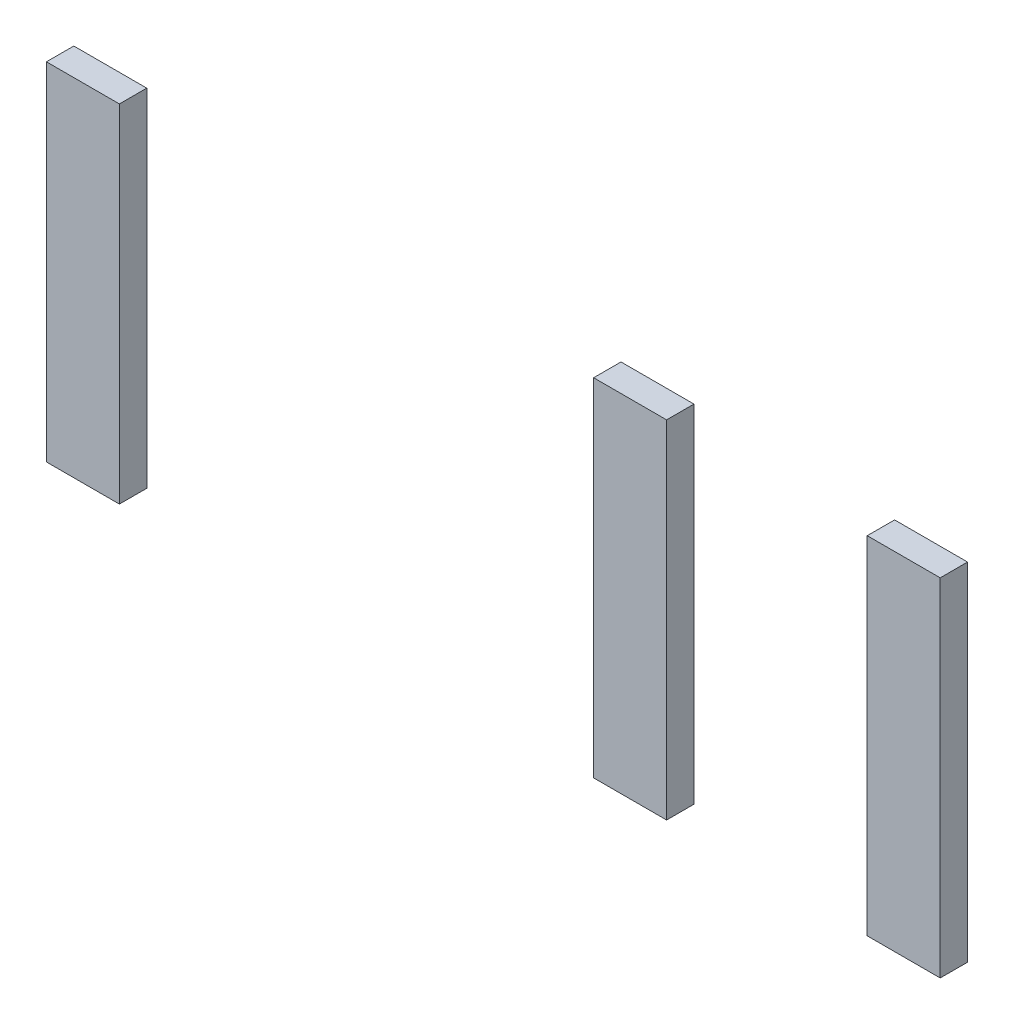
ISO-10303-21;
HEADER;
FILE_DESCRIPTION(('STEP AP214'),'2;1');
FILE_NAME('part.step','',(''),(''),'','','');
FILE_SCHEMA(('AUTOMOTIVE_DESIGN { 1 0 10303 214 1 1 1 1 }'));
ENDSEC;
DATA;
#1=APPLICATION_CONTEXT('core data for automotive mechanical design processes');
#2=APPLICATION_PROTOCOL_DEFINITION('international standard','automotive_design',2000,#1);
#3=PRODUCT_CONTEXT('',#1,'mechanical');
#4=PRODUCT('Part','Part','',(#3));
#5=PRODUCT_RELATED_PRODUCT_CATEGORY('part','',(#4));
#6=PRODUCT_DEFINITION_FORMATION('','',#4);
#7=PRODUCT_DEFINITION_CONTEXT('part definition',#1,'design');
#8=PRODUCT_DEFINITION('design','',#6,#7);
#9=PRODUCT_DEFINITION_SHAPE('','',#8);
#10=(LENGTH_UNIT() NAMED_UNIT(*) SI_UNIT(.MILLI.,.METRE.));
#11=(NAMED_UNIT(*) PLANE_ANGLE_UNIT() SI_UNIT($,.RADIAN.));
#12=(NAMED_UNIT(*) SI_UNIT($,.STERADIAN.) SOLID_ANGLE_UNIT());
#13=UNCERTAINTY_MEASURE_WITH_UNIT(LENGTH_MEASURE(1.E-05),#10,'distance_accuracy_value','');
#14=(GEOMETRIC_REPRESENTATION_CONTEXT(3) GLOBAL_UNCERTAINTY_ASSIGNED_CONTEXT((#13)) GLOBAL_UNIT_ASSIGNED_CONTEXT((#10,
#11,#12)) REPRESENTATION_CONTEXT('',''));
#15=CARTESIAN_POINT('',(0.,0.,0.));
#16=DIRECTION('',(0.,0.,1.));
#17=DIRECTION('',(1.,0.,0.));
#18=AXIS2_PLACEMENT_3D('',#15,#16,#17);
#19=CARTESIAN_POINT('',(0.75,0.329601407051,0.15));
#20=DIRECTION('',(0.,0.,1.));
#21=DIRECTION('',(1.,0.,0.));
#22=AXIS2_PLACEMENT_3D('',#19,#20,#21);
#23=PLANE('',#22);
#24=DIRECTION('',(1.,0.,0.));
#25=VECTOR('',#24,1.);
#26=CARTESIAN_POINT('',(0.75,0.329601407051,0.15));
#27=LINE('',#26,#25);
#28=CARTESIAN_POINT('',(0.55,0.329601407051,0.15));
#29=VERTEX_POINT('',#28);
#30=CARTESIAN_POINT('',(0.95,0.329601407051,0.15));
#31=VERTEX_POINT('',#30);
#32=EDGE_CURVE('P0_E69',#29,#31,#27,.T.);
#33=ORIENTED_EDGE('',*,*,#32,.T.);
#34=DIRECTION('',(0.,-1.,0.));
#35=VECTOR('',#34,1.);
#36=CARTESIAN_POINT('',(0.95,0.329601407051,0.15));
#37=LINE('',#36,#35);
#38=CARTESIAN_POINT('',(0.95,2.229601407051,0.15));
#39=VERTEX_POINT('',#38);
#40=EDGE_CURVE('P0_E28',#39,#31,#37,.T.);
#41=ORIENTED_EDGE('',*,*,#40,.F.);
#42=DIRECTION('',(1.,0.,0.));
#43=VECTOR('',#42,1.);
#44=CARTESIAN_POINT('',(0.75,2.229601407051,0.15));
#45=LINE('',#44,#43);
#46=CARTESIAN_POINT('',(0.55,2.229601407051,0.15));
#47=VERTEX_POINT('',#46);
#48=EDGE_CURVE('P0_E11',#47,#39,#45,.T.);
#49=ORIENTED_EDGE('',*,*,#48,.F.);
#50=DIRECTION('',(0.,1.,0.));
#51=VECTOR('',#50,1.);
#52=CARTESIAN_POINT('',(0.55,0.329601407051,0.15));
#53=LINE('',#52,#51);
#54=EDGE_CURVE('P0_E82',#29,#47,#53,.T.);
#55=ORIENTED_EDGE('',*,*,#54,.F.);
#56=EDGE_LOOP('',(#33,#41,#49,#55));
#57=FACE_BOUND('',#56,.T.);
#58=ADVANCED_FACE('P0_F17',(#57),#23,.T.);
#59=CARTESIAN_POINT('',(0.75,2.229601407051,0.075));
#60=DIRECTION('',(0.,1.,0.));
#61=DIRECTION('',(1.,0.,0.));
#62=AXIS2_PLACEMENT_3D('',#59,#60,#61);
#63=PLANE('',#62);
#64=ORIENTED_EDGE('',*,*,#48,.T.);
#65=DIRECTION('',(0.,0.,1.));
#66=VECTOR('',#65,1.);
#67=CARTESIAN_POINT('',(0.95,2.229601407051,0.075));
#68=LINE('',#67,#66);
#69=CARTESIAN_POINT('',(0.95,2.229601407051,0.));
#70=VERTEX_POINT('',#69);
#71=EDGE_CURVE('P0_E60',#70,#39,#68,.T.);
#72=ORIENTED_EDGE('',*,*,#71,.F.);
#73=DIRECTION('',(1.,0.,0.));
#74=VECTOR('',#73,1.);
#75=CARTESIAN_POINT('',(0.75,2.229601407051,0.));
#76=LINE('',#75,#74);
#77=CARTESIAN_POINT('',(0.55,2.229601407051,0.));
#78=VERTEX_POINT('',#77);
#79=EDGE_CURVE('P0_E98',#78,#70,#76,.T.);
#80=ORIENTED_EDGE('',*,*,#79,.F.);
#81=DIRECTION('',(0.,0.,-1.));
#82=VECTOR('',#81,1.);
#83=CARTESIAN_POINT('',(0.55,2.229601407051,0.075));
#84=LINE('',#83,#82);
#85=EDGE_CURVE('P0_E85',#47,#78,#84,.T.);
#86=ORIENTED_EDGE('',*,*,#85,.F.);
#87=EDGE_LOOP('',(#64,#72,#80,#86));
#88=FACE_BOUND('',#87,.T.);
#89=ADVANCED_FACE('P0_F121',(#88),#63,.T.);
#90=CARTESIAN_POINT('',(0.95,0.329601407051,0.075));
#91=DIRECTION('',(1.,0.,0.));
#92=DIRECTION('',(0.,1.,0.));
#93=AXIS2_PLACEMENT_3D('',#90,#91,#92);
#94=PLANE('',#93);
#95=DIRECTION('',(0.,0.,-1.));
#96=VECTOR('',#95,1.);
#97=CARTESIAN_POINT('',(0.95,0.329601407051,0.075));
#98=LINE('',#97,#96);
#99=CARTESIAN_POINT('',(0.95,0.329601407051,0.));
#100=VERTEX_POINT('',#99);
#101=EDGE_CURVE('P0_E77',#31,#100,#98,.T.);
#102=ORIENTED_EDGE('',*,*,#101,.T.);
#103=DIRECTION('',(0.,-1.,0.));
#104=VECTOR('',#103,1.);
#105=CARTESIAN_POINT('',(0.95,0.329601407051,0.));
#106=LINE('',#105,#104);
#107=EDGE_CURVE('P0_E21',#70,#100,#106,.T.);
#108=ORIENTED_EDGE('',*,*,#107,.F.);
#109=ORIENTED_EDGE('',*,*,#71,.T.);
#110=ORIENTED_EDGE('',*,*,#40,.T.);
#111=EDGE_LOOP('',(#102,#108,#109,#110));
#112=FACE_BOUND('',#111,.T.);
#113=ADVANCED_FACE('P0_F19',(#112),#94,.T.);
#114=CARTESIAN_POINT('',(0.75,0.329601407051,0.075));
#115=DIRECTION('',(0.,1.,0.));
#116=DIRECTION('',(1.,0.,0.));
#117=AXIS2_PLACEMENT_3D('',#114,#115,#116);
#118=PLANE('',#117);
#119=DIRECTION('',(-1.,0.,0.));
#120=VECTOR('',#119,1.);
#121=CARTESIAN_POINT('',(0.75,0.329601407051,0.));
#122=LINE('',#121,#120);
#123=CARTESIAN_POINT('',(0.55,0.329601407051,0.));
#124=VERTEX_POINT('',#123);
#125=EDGE_CURVE('P0_E110',#100,#124,#122,.T.);
#126=ORIENTED_EDGE('',*,*,#125,.F.);
#127=ORIENTED_EDGE('',*,*,#101,.F.);
#128=ORIENTED_EDGE('',*,*,#32,.F.);
#129=DIRECTION('',(0.,0.,1.));
#130=VECTOR('',#129,1.);
#131=CARTESIAN_POINT('',(0.55,0.329601407051,0.075));
#132=LINE('',#131,#130);
#133=EDGE_CURVE('P0_E74',#124,#29,#132,.T.);
#134=ORIENTED_EDGE('',*,*,#133,.F.);
#135=EDGE_LOOP('',(#126,#127,#128,#134));
#136=FACE_BOUND('',#135,.T.);
#137=ADVANCED_FACE('P0_F72',(#136),#118,.F.);
#138=CARTESIAN_POINT('',(0.55,0.329601407051,0.075));
#139=DIRECTION('',(-1.,0.,0.));
#140=DIRECTION('',(0.,0.,1.));
#141=AXIS2_PLACEMENT_3D('',#138,#139,#140);
#142=PLANE('',#141);
#143=ORIENTED_EDGE('',*,*,#133,.T.);
#144=ORIENTED_EDGE('',*,*,#54,.T.);
#145=ORIENTED_EDGE('',*,*,#85,.T.);
#146=DIRECTION('',(0.,1.,0.));
#147=VECTOR('',#146,1.);
#148=CARTESIAN_POINT('',(0.55,0.329601407051,0.));
#149=LINE('',#148,#147);
#150=EDGE_CURVE('P0_E89',#124,#78,#149,.T.);
#151=ORIENTED_EDGE('',*,*,#150,.F.);
#152=EDGE_LOOP('',(#143,#144,#145,#151));
#153=FACE_BOUND('',#152,.T.);
#154=ADVANCED_FACE('P0_F87',(#153),#142,.T.);
#155=CARTESIAN_POINT('',(0.75,0.329601407051,0.));
#156=DIRECTION('',(0.,0.,-1.));
#157=DIRECTION('',(0.,-1.,0.));
#158=AXIS2_PLACEMENT_3D('',#155,#156,#157);
#159=PLANE('',#158);
#160=ORIENTED_EDGE('',*,*,#125,.T.);
#161=ORIENTED_EDGE('',*,*,#150,.T.);
#162=ORIENTED_EDGE('',*,*,#79,.T.);
#163=ORIENTED_EDGE('',*,*,#107,.T.);
#164=EDGE_LOOP('',(#160,#161,#162,#163));
#165=FACE_BOUND('',#164,.T.);
#166=ADVANCED_FACE('P0_F116',(#165),#159,.T.);
#167=CLOSED_SHELL('',(#58,#89,#113,#137,#154,#166));
#168=MANIFOLD_SOLID_BREP('P0_B1',#167);
#169=CARTESIAN_POINT('',(-2.25,0.329601407051,0.15));
#170=DIRECTION('',(0.,0.,1.));
#171=DIRECTION('',(1.,0.,0.));
#172=AXIS2_PLACEMENT_3D('',#169,#170,#171);
#173=PLANE('',#172);
#174=DIRECTION('',(1.,0.,0.));
#175=VECTOR('',#174,1.);
#176=CARTESIAN_POINT('',(-2.25,0.329601407051,0.15));
#177=LINE('',#176,#175);
#178=CARTESIAN_POINT('',(-2.45,0.329601407051,0.15));
#179=VERTEX_POINT('',#178);
#180=CARTESIAN_POINT('',(-2.05,0.329601407051,0.15));
#181=VERTEX_POINT('',#180);
#182=EDGE_CURVE('P1_E77',#179,#181,#177,.T.);
#183=ORIENTED_EDGE('',*,*,#182,.T.);
#184=DIRECTION('',(0.,-1.,0.));
#185=VECTOR('',#184,1.);
#186=CARTESIAN_POINT('',(-2.05,0.329601407051,0.15));
#187=LINE('',#186,#185);
#188=CARTESIAN_POINT('',(-2.05,2.229601407051,0.15));
#189=VERTEX_POINT('',#188);
#190=EDGE_CURVE('P1_E28',#189,#181,#187,.T.);
#191=ORIENTED_EDGE('',*,*,#190,.F.);
#192=DIRECTION('',(1.,0.,0.));
#193=VECTOR('',#192,1.);
#194=CARTESIAN_POINT('',(-2.25,2.229601407051,0.15));
#195=LINE('',#194,#193);
#196=CARTESIAN_POINT('',(-2.45,2.229601407051,0.15));
#197=VERTEX_POINT('',#196);
#198=EDGE_CURVE('P1_E11',#197,#189,#195,.T.);
#199=ORIENTED_EDGE('',*,*,#198,.F.);
#200=DIRECTION('',(0.,1.,0.));
#201=VECTOR('',#200,1.);
#202=CARTESIAN_POINT('',(-2.45,0.329601407051,0.15));
#203=LINE('',#202,#201);
#204=EDGE_CURVE('P1_E107',#179,#197,#203,.T.);
#205=ORIENTED_EDGE('',*,*,#204,.F.);
#206=EDGE_LOOP('',(#183,#191,#199,#205));
#207=FACE_BOUND('',#206,.T.);
#208=ADVANCED_FACE('P1_F17',(#207),#173,.T.);
#209=CARTESIAN_POINT('',(-2.25,2.229601407051,0.075));
#210=DIRECTION('',(0.,1.,0.));
#211=DIRECTION('',(1.,0.,0.));
#212=AXIS2_PLACEMENT_3D('',#209,#210,#211);
#213=PLANE('',#212);
#214=ORIENTED_EDGE('',*,*,#198,.T.);
#215=DIRECTION('',(0.,0.,1.));
#216=VECTOR('',#215,1.);
#217=CARTESIAN_POINT('',(-2.05,2.229601407051,0.075));
#218=LINE('',#217,#216);
#219=CARTESIAN_POINT('',(-2.05,2.229601407051,0.));
#220=VERTEX_POINT('',#219);
#221=EDGE_CURVE('P1_E110',#220,#189,#218,.T.);
#222=ORIENTED_EDGE('',*,*,#221,.F.);
#223=DIRECTION('',(1.,0.,0.));
#224=VECTOR('',#223,1.);
#225=CARTESIAN_POINT('',(-2.25,2.229601407051,0.));
#226=LINE('',#225,#224);
#227=CARTESIAN_POINT('',(-2.45,2.229601407051,0.));
#228=VERTEX_POINT('',#227);
#229=EDGE_CURVE('P1_E85',#228,#220,#226,.T.);
#230=ORIENTED_EDGE('',*,*,#229,.F.);
#231=DIRECTION('',(0.,0.,-1.));
#232=VECTOR('',#231,1.);
#233=CARTESIAN_POINT('',(-2.45,2.229601407051,0.075));
#234=LINE('',#233,#232);
#235=EDGE_CURVE('P1_E78',#197,#228,#234,.T.);
#236=ORIENTED_EDGE('',*,*,#235,.F.);
#237=EDGE_LOOP('',(#214,#222,#230,#236));
#238=FACE_BOUND('',#237,.T.);
#239=ADVANCED_FACE('P1_F121',(#238),#213,.T.);
#240=CARTESIAN_POINT('',(-2.05,0.329601407051,0.075));
#241=DIRECTION('',(1.,0.,0.));
#242=DIRECTION('',(0.,1.,0.));
#243=AXIS2_PLACEMENT_3D('',#240,#241,#242);
#244=PLANE('',#243);
#245=DIRECTION('',(0.,0.,-1.));
#246=VECTOR('',#245,1.);
#247=CARTESIAN_POINT('',(-2.05,0.329601407051,0.075));
#248=LINE('',#247,#246);
#249=CARTESIAN_POINT('',(-2.05,0.329601407051,0.));
#250=VERTEX_POINT('',#249);
#251=EDGE_CURVE('P1_E67',#181,#250,#248,.T.);
#252=ORIENTED_EDGE('',*,*,#251,.T.);
#253=DIRECTION('',(0.,-1.,0.));
#254=VECTOR('',#253,1.);
#255=CARTESIAN_POINT('',(-2.05,0.329601407051,0.));
#256=LINE('',#255,#254);
#257=EDGE_CURVE('P1_E71',#220,#250,#256,.T.);
#258=ORIENTED_EDGE('',*,*,#257,.F.);
#259=ORIENTED_EDGE('',*,*,#221,.T.);
#260=ORIENTED_EDGE('',*,*,#190,.T.);
#261=EDGE_LOOP('',(#252,#258,#259,#260));
#262=FACE_BOUND('',#261,.T.);
#263=ADVANCED_FACE('P1_F69',(#262),#244,.T.);
#264=CARTESIAN_POINT('',(-2.25,0.329601407051,0.075));
#265=DIRECTION('',(0.,1.,0.));
#266=DIRECTION('',(1.,0.,0.));
#267=AXIS2_PLACEMENT_3D('',#264,#265,#266);
#268=PLANE('',#267);
#269=DIRECTION('',(-1.,0.,0.));
#270=VECTOR('',#269,1.);
#271=CARTESIAN_POINT('',(-2.25,0.329601407051,0.));
#272=LINE('',#271,#270);
#273=CARTESIAN_POINT('',(-2.45,0.329601407051,0.));
#274=VERTEX_POINT('',#273);
#275=EDGE_CURVE('P1_E21',#250,#274,#272,.T.);
#276=ORIENTED_EDGE('',*,*,#275,.F.);
#277=ORIENTED_EDGE('',*,*,#251,.F.);
#278=ORIENTED_EDGE('',*,*,#182,.F.);
#279=DIRECTION('',(0.,0.,1.));
#280=VECTOR('',#279,1.);
#281=CARTESIAN_POINT('',(-2.45,0.329601407051,0.075));
#282=LINE('',#281,#280);
#283=EDGE_CURVE('P1_E87',#274,#179,#282,.T.);
#284=ORIENTED_EDGE('',*,*,#283,.F.);
#285=EDGE_LOOP('',(#276,#277,#278,#284));
#286=FACE_BOUND('',#285,.T.);
#287=ADVANCED_FACE('P1_F89',(#286),#268,.F.);
#288=CARTESIAN_POINT('',(-2.45,0.329601407051,0.075));
#289=DIRECTION('',(-1.,0.,0.));
#290=DIRECTION('',(0.,0.,1.));
#291=AXIS2_PLACEMENT_3D('',#288,#289,#290);
#292=PLANE('',#291);
#293=ORIENTED_EDGE('',*,*,#283,.T.);
#294=ORIENTED_EDGE('',*,*,#204,.T.);
#295=ORIENTED_EDGE('',*,*,#235,.T.);
#296=DIRECTION('',(0.,1.,0.));
#297=VECTOR('',#296,1.);
#298=CARTESIAN_POINT('',(-2.45,0.329601407051,0.));
#299=LINE('',#298,#297);
#300=EDGE_CURVE('P1_E93',#274,#228,#299,.T.);
#301=ORIENTED_EDGE('',*,*,#300,.F.);
#302=EDGE_LOOP('',(#293,#294,#295,#301));
#303=FACE_BOUND('',#302,.T.);
#304=ADVANCED_FACE('P1_F19',(#303),#292,.T.);
#305=CARTESIAN_POINT('',(-2.25,0.329601407051,0.));
#306=DIRECTION('',(0.,0.,-1.));
#307=DIRECTION('',(0.,-1.,0.));
#308=AXIS2_PLACEMENT_3D('',#305,#306,#307);
#309=PLANE('',#308);
#310=ORIENTED_EDGE('',*,*,#275,.T.);
#311=ORIENTED_EDGE('',*,*,#300,.T.);
#312=ORIENTED_EDGE('',*,*,#229,.T.);
#313=ORIENTED_EDGE('',*,*,#257,.T.);
#314=EDGE_LOOP('',(#310,#311,#312,#313));
#315=FACE_BOUND('',#314,.T.);
#316=ADVANCED_FACE('P1_F82',(#315),#309,.T.);
#317=CLOSED_SHELL('',(#208,#239,#263,#287,#304,#316));
#318=MANIFOLD_SOLID_BREP('P1_B1',#317);
#319=CARTESIAN_POINT('',(2.25,0.329601407051,0.15));
#320=DIRECTION('',(0.,0.,1.));
#321=DIRECTION('',(1.,0.,0.));
#322=AXIS2_PLACEMENT_3D('',#319,#320,#321);
#323=PLANE('',#322);
#324=DIRECTION('',(1.,0.,0.));
#325=VECTOR('',#324,1.);
#326=CARTESIAN_POINT('',(2.25,0.329601407051,0.15));
#327=LINE('',#326,#325);
#328=CARTESIAN_POINT('',(2.05,0.329601407051,0.15));
#329=VERTEX_POINT('',#328);
#330=CARTESIAN_POINT('',(2.45,0.329601407051,0.15));
#331=VERTEX_POINT('',#330);
#332=EDGE_CURVE('P2_E64',#329,#331,#327,.T.);
#333=ORIENTED_EDGE('',*,*,#332,.T.);
#334=DIRECTION('',(0.,-1.,0.));
#335=VECTOR('',#334,1.);
#336=CARTESIAN_POINT('',(2.45,0.329601407051,0.15));
#337=LINE('',#336,#335);
#338=CARTESIAN_POINT('',(2.45,2.229601407051,0.15));
#339=VERTEX_POINT('',#338);
#340=EDGE_CURVE('P2_E28',#339,#331,#337,.T.);
#341=ORIENTED_EDGE('',*,*,#340,.F.);
#342=DIRECTION('',(1.,0.,0.));
#343=VECTOR('',#342,1.);
#344=CARTESIAN_POINT('',(2.25,2.229601407051,0.15));
#345=LINE('',#344,#343);
#346=CARTESIAN_POINT('',(2.05,2.229601407051,0.15));
#347=VERTEX_POINT('',#346);
#348=EDGE_CURVE('P2_E11',#347,#339,#345,.T.);
#349=ORIENTED_EDGE('',*,*,#348,.F.);
#350=DIRECTION('',(0.,1.,0.));
#351=VECTOR('',#350,1.);
#352=CARTESIAN_POINT('',(2.05,0.329601407051,0.15));
#353=LINE('',#352,#351);
#354=EDGE_CURVE('P2_E91',#329,#347,#353,.T.);
#355=ORIENTED_EDGE('',*,*,#354,.F.);
#356=EDGE_LOOP('',(#333,#341,#349,#355));
#357=FACE_BOUND('',#356,.T.);
#358=ADVANCED_FACE('P2_F17',(#357),#323,.T.);
#359=CARTESIAN_POINT('',(2.25,2.229601407051,0.075));
#360=DIRECTION('',(0.,1.,0.));
#361=DIRECTION('',(1.,0.,0.));
#362=AXIS2_PLACEMENT_3D('',#359,#360,#361);
#363=PLANE('',#362);
#364=ORIENTED_EDGE('',*,*,#348,.T.);
#365=DIRECTION('',(0.,0.,1.));
#366=VECTOR('',#365,1.);
#367=CARTESIAN_POINT('',(2.45,2.229601407051,0.075));
#368=LINE('',#367,#366);
#369=CARTESIAN_POINT('',(2.45,2.229601407051,0.));
#370=VERTEX_POINT('',#369);
#371=EDGE_CURVE('P2_E69',#370,#339,#368,.T.);
#372=ORIENTED_EDGE('',*,*,#371,.F.);
#373=DIRECTION('',(1.,0.,0.));
#374=VECTOR('',#373,1.);
#375=CARTESIAN_POINT('',(2.25,2.229601407051,0.));
#376=LINE('',#375,#374);
#377=CARTESIAN_POINT('',(2.05,2.229601407051,0.));
#378=VERTEX_POINT('',#377);
#379=EDGE_CURVE('P2_E100',#378,#370,#376,.T.);
#380=ORIENTED_EDGE('',*,*,#379,.F.);
#381=DIRECTION('',(0.,0.,-1.));
#382=VECTOR('',#381,1.);
#383=CARTESIAN_POINT('',(2.05,2.229601407051,0.075));
#384=LINE('',#383,#382);
#385=EDGE_CURVE('P2_E21',#347,#378,#384,.T.);
#386=ORIENTED_EDGE('',*,*,#385,.F.);
#387=EDGE_LOOP('',(#364,#372,#380,#386));
#388=FACE_BOUND('',#387,.T.);
#389=ADVANCED_FACE('P2_F126',(#388),#363,.T.);
#390=CARTESIAN_POINT('',(2.45,0.329601407051,0.075));
#391=DIRECTION('',(1.,0.,0.));
#392=DIRECTION('',(0.,1.,0.));
#393=AXIS2_PLACEMENT_3D('',#390,#391,#392);
#394=PLANE('',#393);
#395=DIRECTION('',(0.,0.,-1.));
#396=VECTOR('',#395,1.);
#397=CARTESIAN_POINT('',(2.45,0.329601407051,0.075));
#398=LINE('',#397,#396);
#399=CARTESIAN_POINT('',(2.45,0.329601407051,0.));
#400=VERTEX_POINT('',#399);
#401=EDGE_CURVE('P2_E77',#331,#400,#398,.T.);
#402=ORIENTED_EDGE('',*,*,#401,.T.);
#403=DIRECTION('',(0.,-1.,0.));
#404=VECTOR('',#403,1.);
#405=CARTESIAN_POINT('',(2.45,0.329601407051,0.));
#406=LINE('',#405,#404);
#407=EDGE_CURVE('P2_E92',#370,#400,#406,.T.);
#408=ORIENTED_EDGE('',*,*,#407,.F.);
#409=ORIENTED_EDGE('',*,*,#371,.T.);
#410=ORIENTED_EDGE('',*,*,#340,.T.);
#411=EDGE_LOOP('',(#402,#408,#409,#410));
#412=FACE_BOUND('',#411,.T.);
#413=ADVANCED_FACE('P2_F125',(#412),#394,.T.);
#414=CARTESIAN_POINT('',(2.25,0.329601407051,0.075));
#415=DIRECTION('',(0.,1.,0.));
#416=DIRECTION('',(1.,0.,0.));
#417=AXIS2_PLACEMENT_3D('',#414,#415,#416);
#418=PLANE('',#417);
#419=DIRECTION('',(-1.,0.,0.));
#420=VECTOR('',#419,1.);
#421=CARTESIAN_POINT('',(2.25,0.329601407051,0.));
#422=LINE('',#421,#420);
#423=CARTESIAN_POINT('',(2.05,0.329601407051,0.));
#424=VERTEX_POINT('',#423);
#425=EDGE_CURVE('P2_E87',#400,#424,#422,.T.);
#426=ORIENTED_EDGE('',*,*,#425,.F.);
#427=ORIENTED_EDGE('',*,*,#401,.F.);
#428=ORIENTED_EDGE('',*,*,#332,.F.);
#429=DIRECTION('',(0.,0.,1.));
#430=VECTOR('',#429,1.);
#431=CARTESIAN_POINT('',(2.05,0.329601407051,0.075));
#432=LINE('',#431,#430);
#433=EDGE_CURVE('P2_E84',#424,#329,#432,.T.);
#434=ORIENTED_EDGE('',*,*,#433,.F.);
#435=EDGE_LOOP('',(#426,#427,#428,#434));
#436=FACE_BOUND('',#435,.T.);
#437=ADVANCED_FACE('P2_F19',(#436),#418,.F.);
#438=CARTESIAN_POINT('',(2.05,0.329601407051,0.075));
#439=DIRECTION('',(-1.,0.,0.));
#440=DIRECTION('',(0.,0.,1.));
#441=AXIS2_PLACEMENT_3D('',#438,#439,#440);
#442=PLANE('',#441);
#443=ORIENTED_EDGE('',*,*,#433,.T.);
#444=ORIENTED_EDGE('',*,*,#354,.T.);
#445=ORIENTED_EDGE('',*,*,#385,.T.);
#446=DIRECTION('',(0.,1.,0.));
#447=VECTOR('',#446,1.);
#448=CARTESIAN_POINT('',(2.05,0.329601407051,0.));
#449=LINE('',#448,#447);
#450=EDGE_CURVE('P2_E95',#424,#378,#449,.T.);
#451=ORIENTED_EDGE('',*,*,#450,.F.);
#452=EDGE_LOOP('',(#443,#444,#445,#451));
#453=FACE_BOUND('',#452,.T.);
#454=ADVANCED_FACE('P2_F96',(#453),#442,.T.);
#455=CARTESIAN_POINT('',(2.25,0.329601407051,0.));
#456=DIRECTION('',(0.,0.,-1.));
#457=DIRECTION('',(0.,-1.,0.));
#458=AXIS2_PLACEMENT_3D('',#455,#456,#457);
#459=PLANE('',#458);
#460=ORIENTED_EDGE('',*,*,#425,.T.);
#461=ORIENTED_EDGE('',*,*,#450,.T.);
#462=ORIENTED_EDGE('',*,*,#379,.T.);
#463=ORIENTED_EDGE('',*,*,#407,.T.);
#464=EDGE_LOOP('',(#460,#461,#462,#463));
#465=FACE_BOUND('',#464,.T.);
#466=ADVANCED_FACE('P2_F102',(#465),#459,.T.);
#467=CLOSED_SHELL('',(#358,#389,#413,#437,#454,#466));
#468=MANIFOLD_SOLID_BREP('P2_B1',#467);
#469=ADVANCED_BREP_SHAPE_REPRESENTATION('',(#18,#168,#318,#468),#14);
#470=SHAPE_DEFINITION_REPRESENTATION(#9,#469);
ENDSEC;
END-ISO-10303-21;
